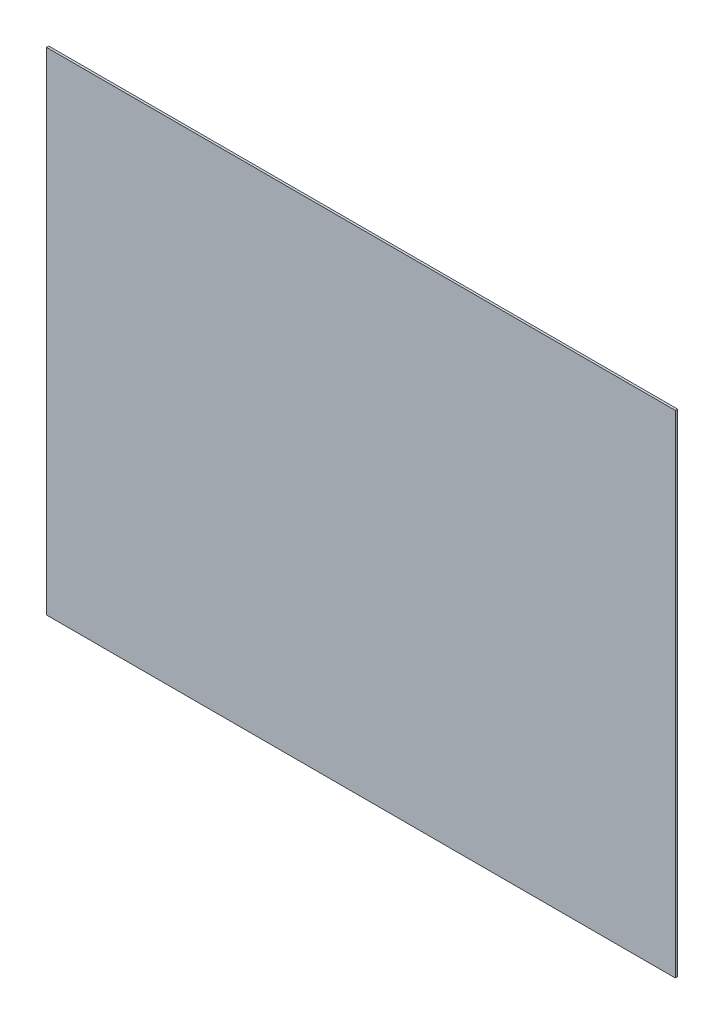
ISO-10303-21;
HEADER;
FILE_DESCRIPTION(('STEP AP214'),'2;1');
FILE_NAME('part.step','',(''),(''),'','','');
FILE_SCHEMA(('AUTOMOTIVE_DESIGN { 1 0 10303 214 1 1 1 1 }'));
ENDSEC;
DATA;
#1=APPLICATION_CONTEXT('core data for automotive mechanical design processes');
#2=APPLICATION_PROTOCOL_DEFINITION('international standard','automotive_design',2000,#1);
#3=PRODUCT_CONTEXT('',#1,'mechanical');
#4=PRODUCT('Part','Part','',(#3));
#5=PRODUCT_RELATED_PRODUCT_CATEGORY('part','',(#4));
#6=PRODUCT_DEFINITION_FORMATION('','',#4);
#7=PRODUCT_DEFINITION_CONTEXT('part definition',#1,'design');
#8=PRODUCT_DEFINITION('design','',#6,#7);
#9=PRODUCT_DEFINITION_SHAPE('','',#8);
#10=(LENGTH_UNIT() NAMED_UNIT(*) SI_UNIT(.MILLI.,.METRE.));
#11=(NAMED_UNIT(*) PLANE_ANGLE_UNIT() SI_UNIT($,.RADIAN.));
#12=(NAMED_UNIT(*) SI_UNIT($,.STERADIAN.) SOLID_ANGLE_UNIT());
#13=UNCERTAINTY_MEASURE_WITH_UNIT(LENGTH_MEASURE(1.E-05),#10,'distance_accuracy_value','');
#14=(GEOMETRIC_REPRESENTATION_CONTEXT(3) GLOBAL_UNCERTAINTY_ASSIGNED_CONTEXT((#13)) GLOBAL_UNIT_ASSIGNED_CONTEXT((#10,
#11,#12)) REPRESENTATION_CONTEXT('',''));
#15=CARTESIAN_POINT('',(0.,0.,0.));
#16=DIRECTION('',(0.,0.,1.));
#17=DIRECTION('',(1.,0.,0.));
#18=AXIS2_PLACEMENT_3D('',#15,#16,#17);
#19=CARTESIAN_POINT('',(0.,0.,2.));
#20=DIRECTION('',(1.,0.,0.));
#21=DIRECTION('',(0.,0.,-1.));
#22=AXIS2_PLACEMENT_3D('',#19,#20,#21);
#23=PLANE('',#22);
#24=DIRECTION('',(0.,-1.,0.));
#25=VECTOR('',#24,1.);
#26=CARTESIAN_POINT('',(0.,0.,0.));
#27=LINE('',#26,#25);
#28=CARTESIAN_POINT('',(0.,430.,0.));
#29=VERTEX_POINT('',#28);
#30=CARTESIAN_POINT('',(0.,0.,0.));
#31=VERTEX_POINT('',#30);
#32=EDGE_CURVE('E93',#29,#31,#27,.T.);
#33=ORIENTED_EDGE('',*,*,#32,.T.);
#34=DIRECTION('',(0.,0.,-1.));
#35=VECTOR('',#34,1.);
#36=CARTESIAN_POINT('',(0.,0.,2.));
#37=LINE('',#36,#35);
#38=CARTESIAN_POINT('',(0.,0.,2.));
#39=VERTEX_POINT('',#38);
#40=EDGE_CURVE('E11',#39,#31,#37,.T.);
#41=ORIENTED_EDGE('',*,*,#40,.F.);
#42=DIRECTION('',(0.,-1.,0.));
#43=VECTOR('',#42,1.);
#44=CARTESIAN_POINT('',(0.,0.,2.));
#45=LINE('',#44,#43);
#46=CARTESIAN_POINT('',(0.,430.,2.));
#47=VERTEX_POINT('',#46);
#48=EDGE_CURVE('E81',#47,#39,#45,.T.);
#49=ORIENTED_EDGE('',*,*,#48,.F.);
#50=DIRECTION('',(0.,0.,-1.));
#51=VECTOR('',#50,1.);
#52=CARTESIAN_POINT('',(0.,430.,2.));
#53=LINE('',#52,#51);
#54=EDGE_CURVE('E89',#47,#29,#53,.T.);
#55=ORIENTED_EDGE('',*,*,#54,.T.);
#56=EDGE_LOOP('',(#33,#41,#49,#55));
#57=FACE_BOUND('',#56,.T.);
#58=ADVANCED_FACE('F30',(#57),#23,.F.);
#59=CARTESIAN_POINT('',(0.,0.,2.));
#60=DIRECTION('',(0.,1.,0.));
#61=DIRECTION('',(0.,0.,1.));
#62=AXIS2_PLACEMENT_3D('',#59,#60,#61);
#63=PLANE('',#62);
#64=DIRECTION('',(1.,0.,0.));
#65=VECTOR('',#64,1.);
#66=CARTESIAN_POINT('',(0.,0.,0.));
#67=LINE('',#66,#65);
#68=CARTESIAN_POINT('',(550.,0.,0.));
#69=VERTEX_POINT('',#68);
#70=EDGE_CURVE('E85',#31,#69,#67,.T.);
#71=ORIENTED_EDGE('',*,*,#70,.T.);
#72=DIRECTION('',(0.,0.,-1.));
#73=VECTOR('',#72,1.);
#74=CARTESIAN_POINT('',(550.,0.,2.));
#75=LINE('',#74,#73);
#76=CARTESIAN_POINT('',(550.,0.,2.));
#77=VERTEX_POINT('',#76);
#78=EDGE_CURVE('E38',#77,#69,#75,.T.);
#79=ORIENTED_EDGE('',*,*,#78,.F.);
#80=DIRECTION('',(1.,0.,0.));
#81=VECTOR('',#80,1.);
#82=CARTESIAN_POINT('',(0.,0.,2.));
#83=LINE('',#82,#81);
#84=EDGE_CURVE('E76',#39,#77,#83,.T.);
#85=ORIENTED_EDGE('',*,*,#84,.F.);
#86=ORIENTED_EDGE('',*,*,#40,.T.);
#87=EDGE_LOOP('',(#71,#79,#85,#86));
#88=FACE_BOUND('',#87,.T.);
#89=ADVANCED_FACE('F84',(#88),#63,.F.);
#90=CARTESIAN_POINT('',(550.,0.,2.));
#91=DIRECTION('',(-1.,0.,0.));
#92=DIRECTION('',(0.,0.,1.));
#93=AXIS2_PLACEMENT_3D('',#90,#91,#92);
#94=PLANE('',#93);
#95=DIRECTION('',(0.,1.,0.));
#96=VECTOR('',#95,1.);
#97=CARTESIAN_POINT('',(550.,0.,0.));
#98=LINE('',#97,#96);
#99=CARTESIAN_POINT('',(550.,430.,0.));
#100=VERTEX_POINT('',#99);
#101=EDGE_CURVE('E63',#69,#100,#98,.T.);
#102=ORIENTED_EDGE('',*,*,#101,.T.);
#103=DIRECTION('',(0.,0.,-1.));
#104=VECTOR('',#103,1.);
#105=CARTESIAN_POINT('',(550.,430.,2.));
#106=LINE('',#105,#104);
#107=CARTESIAN_POINT('',(550.,430.,2.));
#108=VERTEX_POINT('',#107);
#109=EDGE_CURVE('E86',#108,#100,#106,.T.);
#110=ORIENTED_EDGE('',*,*,#109,.F.);
#111=DIRECTION('',(0.,1.,0.));
#112=VECTOR('',#111,1.);
#113=CARTESIAN_POINT('',(550.,0.,2.));
#114=LINE('',#113,#112);
#115=EDGE_CURVE('E79',#77,#108,#114,.T.);
#116=ORIENTED_EDGE('',*,*,#115,.F.);
#117=ORIENTED_EDGE('',*,*,#78,.T.);
#118=EDGE_LOOP('',(#102,#110,#116,#117));
#119=FACE_BOUND('',#118,.T.);
#120=ADVANCED_FACE('F87',(#119),#94,.F.);
#121=CARTESIAN_POINT('',(0.,430.,2.));
#122=DIRECTION('',(0.,-1.,0.));
#123=DIRECTION('',(0.,0.,-1.));
#124=AXIS2_PLACEMENT_3D('',#121,#122,#123);
#125=PLANE('',#124);
#126=DIRECTION('',(-1.,0.,0.));
#127=VECTOR('',#126,1.);
#128=CARTESIAN_POINT('',(0.,430.,0.));
#129=LINE('',#128,#127);
#130=EDGE_CURVE('E69',#100,#29,#129,.T.);
#131=ORIENTED_EDGE('',*,*,#130,.T.);
#132=ORIENTED_EDGE('',*,*,#54,.F.);
#133=DIRECTION('',(-1.,0.,0.));
#134=VECTOR('',#133,1.);
#135=CARTESIAN_POINT('',(0.,430.,2.));
#136=LINE('',#135,#134);
#137=EDGE_CURVE('E46',#108,#47,#136,.T.);
#138=ORIENTED_EDGE('',*,*,#137,.F.);
#139=ORIENTED_EDGE('',*,*,#109,.T.);
#140=EDGE_LOOP('',(#131,#132,#138,#139));
#141=FACE_BOUND('',#140,.T.);
#142=ADVANCED_FACE('F100',(#141),#125,.F.);
#143=CARTESIAN_POINT('',(0.,0.,2.));
#144=DIRECTION('',(0.,0.,-1.));
#145=DIRECTION('',(-1.,0.,0.));
#146=AXIS2_PLACEMENT_3D('',#143,#144,#145);
#147=PLANE('',#146);
#148=ORIENTED_EDGE('',*,*,#48,.T.);
#149=ORIENTED_EDGE('',*,*,#84,.T.);
#150=ORIENTED_EDGE('',*,*,#115,.T.);
#151=ORIENTED_EDGE('',*,*,#137,.T.);
#152=EDGE_LOOP('',(#148,#149,#150,#151));
#153=FACE_BOUND('',#152,.T.);
#154=ADVANCED_FACE('F77',(#153),#147,.F.);
#155=CARTESIAN_POINT('',(0.,0.,0.));
#156=DIRECTION('',(0.,0.,-1.));
#157=DIRECTION('',(-1.,0.,0.));
#158=AXIS2_PLACEMENT_3D('',#155,#156,#157);
#159=PLANE('',#158);
#160=ORIENTED_EDGE('',*,*,#32,.F.);
#161=ORIENTED_EDGE('',*,*,#130,.F.);
#162=ORIENTED_EDGE('',*,*,#101,.F.);
#163=ORIENTED_EDGE('',*,*,#70,.F.);
#164=EDGE_LOOP('',(#160,#161,#162,#163));
#165=FACE_BOUND('',#164,.T.);
#166=ADVANCED_FACE('F103',(#165),#159,.T.);
#167=CLOSED_SHELL('',(#58,#89,#120,#142,#154,#166));
#168=MANIFOLD_SOLID_BREP('B2',#167);
#169=ADVANCED_BREP_SHAPE_REPRESENTATION('',(#18,#168),#14);
#170=SHAPE_DEFINITION_REPRESENTATION(#9,#169);
ENDSEC;
END-ISO-10303-21;
